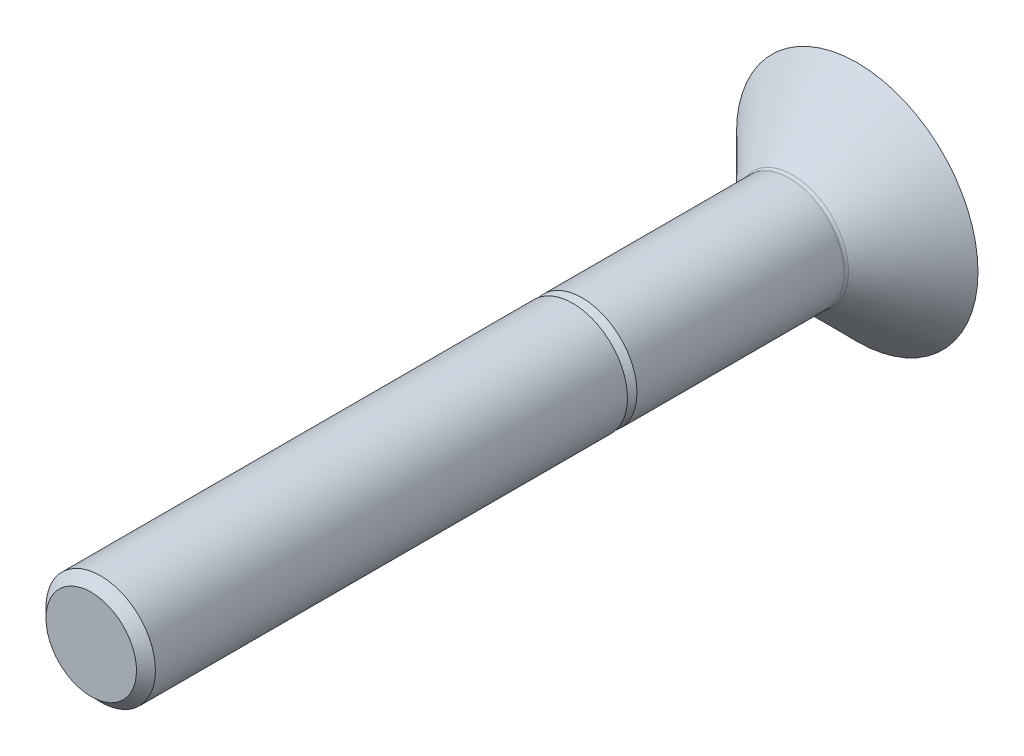
ISO-10303-21;
HEADER;
FILE_DESCRIPTION(('STEP AP214'),'2;1');
FILE_NAME('part.step','',(''),(''),'','','');
FILE_SCHEMA(('AUTOMOTIVE_DESIGN { 1 0 10303 214 1 1 1 1 }'));
ENDSEC;
DATA;
#1=APPLICATION_CONTEXT('core data for automotive mechanical design processes');
#2=APPLICATION_PROTOCOL_DEFINITION('international standard','automotive_design',2000,#1);
#3=PRODUCT_CONTEXT('',#1,'mechanical');
#4=PRODUCT('Part','Part','',(#3));
#5=PRODUCT_RELATED_PRODUCT_CATEGORY('part','',(#4));
#6=PRODUCT_DEFINITION_FORMATION('','',#4);
#7=PRODUCT_DEFINITION_CONTEXT('part definition',#1,'design');
#8=PRODUCT_DEFINITION('design','',#6,#7);
#9=PRODUCT_DEFINITION_SHAPE('','',#8);
#10=(LENGTH_UNIT() NAMED_UNIT(*) SI_UNIT(.MILLI.,.METRE.));
#11=(NAMED_UNIT(*) PLANE_ANGLE_UNIT() SI_UNIT($,.RADIAN.));
#12=(NAMED_UNIT(*) SI_UNIT($,.STERADIAN.) SOLID_ANGLE_UNIT());
#13=UNCERTAINTY_MEASURE_WITH_UNIT(LENGTH_MEASURE(1.E-05),#10,'distance_accuracy_value','');
#14=(GEOMETRIC_REPRESENTATION_CONTEXT(3) GLOBAL_UNCERTAINTY_ASSIGNED_CONTEXT((#13)) GLOBAL_UNIT_ASSIGNED_CONTEXT((#10,
#11,#12)) REPRESENTATION_CONTEXT('',''));
#15=CARTESIAN_POINT('',(0.,0.,0.));
#16=DIRECTION('',(0.,0.,1.));
#17=DIRECTION('',(1.,0.,0.));
#18=AXIS2_PLACEMENT_3D('',#15,#16,#17);
#19=CARTESIAN_POINT('',(0.,1.0335,35.));
#20=DIRECTION('',(0.,0.,1.));
#21=DIRECTION('',(0.,1.,0.));
#22=AXIS2_PLACEMENT_3D('',#19,#20,#21);
#23=PLANE('',#22);
#24=CARTESIAN_POINT('',(0.,0.,35.));
#25=DIRECTION('',(0.,0.,1.));
#26=DIRECTION('',(0.,1.,0.));
#27=AXIS2_PLACEMENT_3D('',#24,#25,#26);
#28=CIRCLE('',#27,2.067);
#29=CARTESIAN_POINT('',(0.,2.067,35.));
#30=VERTEX_POINT('',#29);
#31=EDGE_CURVE('E12',#30,#30,#28,.T.);
#32=ORIENTED_EDGE('',*,*,#31,.T.);
#33=EDGE_LOOP('',(#32));
#34=FACE_BOUND('',#33,.T.);
#35=ADVANCED_FACE('F19',(#34),#23,.T.);
#36=CARTESIAN_POINT('',(0.,0.,34.7835));
#37=DIRECTION('',(0.,0.,-1.));
#38=DIRECTION('',(0.,1.,0.));
#39=AXIS2_PLACEMENT_3D('',#36,#37,#38);
#40=CONICAL_SURFACE('',#39,2.2835,0.785398163397448);
#41=CARTESIAN_POINT('',(0.,0.,34.567));
#42=DIRECTION('',(0.,0.,1.));
#43=DIRECTION('',(0.,1.,0.));
#44=AXIS2_PLACEMENT_3D('',#41,#42,#43);
#45=CIRCLE('',#44,2.5);
#46=CARTESIAN_POINT('',(0.,2.5,34.567));
#47=VERTEX_POINT('',#46);
#48=EDGE_CURVE('E29',#47,#47,#45,.T.);
#49=ORIENTED_EDGE('',*,*,#48,.T.);
#50=EDGE_LOOP('',(#49));
#51=FACE_BOUND('',#50,.T.);
#52=ORIENTED_EDGE('',*,*,#31,.F.);
#53=EDGE_LOOP('',(#52));
#54=FACE_BOUND('',#53,.T.);
#55=ADVANCED_FACE('F288',(#51,#54),#40,.T.);
#56=CARTESIAN_POINT('',(0.,0.,23.7835));
#57=DIRECTION('',(0.,0.,-1.));
#58=DIRECTION('',(0.,1.,0.));
#59=AXIS2_PLACEMENT_3D('',#56,#57,#58);
#60=CYLINDRICAL_SURFACE('',#59,2.5);
#61=CARTESIAN_POINT('',(0.,0.,13.));
#62=DIRECTION('',(0.,0.,1.));
#63=DIRECTION('',(0.,1.,0.));
#64=AXIS2_PLACEMENT_3D('',#61,#62,#63);
#65=CIRCLE('',#64,2.5);
#66=CARTESIAN_POINT('',(0.,2.5,13.));
#67=VERTEX_POINT('',#66);
#68=EDGE_CURVE('E162',#67,#67,#65,.T.);
#69=ORIENTED_EDGE('',*,*,#68,.T.);
#70=EDGE_LOOP('',(#69));
#71=FACE_BOUND('',#70,.T.);
#72=ORIENTED_EDGE('',*,*,#48,.F.);
#73=EDGE_LOOP('',(#72));
#74=FACE_BOUND('',#73,.T.);
#75=ADVANCED_FACE('F292',(#71,#74),#60,.T.);
#76=CARTESIAN_POINT('',(0.,2.2835,13.));
#77=DIRECTION('',(0.,0.,-1.));
#78=DIRECTION('',(0.,-1.,0.));
#79=AXIS2_PLACEMENT_3D('',#76,#77,#78);
#80=PLANE('',#79);
#81=CARTESIAN_POINT('',(0.,0.,13.));
#82=DIRECTION('',(0.,0.,1.));
#83=DIRECTION('',(0.,1.,0.));
#84=AXIS2_PLACEMENT_3D('',#81,#82,#83);
#85=CIRCLE('',#84,2.067);
#86=CARTESIAN_POINT('',(0.,2.067,13.));
#87=VERTEX_POINT('',#86);
#88=EDGE_CURVE('E166',#87,#87,#85,.T.);
#89=ORIENTED_EDGE('',*,*,#88,.T.);
#90=EDGE_LOOP('',(#89));
#91=FACE_BOUND('',#90,.T.);
#92=ORIENTED_EDGE('',*,*,#68,.F.);
#93=EDGE_LOOP('',(#92));
#94=FACE_BOUND('',#93,.T.);
#95=ADVANCED_FACE('F299',(#91,#94),#80,.T.);
#96=CARTESIAN_POINT('',(0.,0.,12.7835));
#97=DIRECTION('',(0.,0.,-1.));
#98=DIRECTION('',(0.,1.,0.));
#99=AXIS2_PLACEMENT_3D('',#96,#97,#98);
#100=CONICAL_SURFACE('',#99,2.2835,0.785398163397448);
#101=CARTESIAN_POINT('',(0.,0.,12.567));
#102=DIRECTION('',(0.,0.,1.));
#103=DIRECTION('',(0.,1.,0.));
#104=AXIS2_PLACEMENT_3D('',#101,#102,#103);
#105=CIRCLE('',#104,2.5);
#106=CARTESIAN_POINT('',(0.,2.5,12.567));
#107=VERTEX_POINT('',#106);
#108=EDGE_CURVE('E206',#107,#107,#105,.T.);
#109=ORIENTED_EDGE('',*,*,#108,.T.);
#110=EDGE_LOOP('',(#109));
#111=FACE_BOUND('',#110,.T.);
#112=ORIENTED_EDGE('',*,*,#88,.F.);
#113=EDGE_LOOP('',(#112));
#114=FACE_BOUND('',#113,.T.);
#115=ADVANCED_FACE('F296',(#111,#114),#100,.T.);
#116=CARTESIAN_POINT('',(0.,0.,7.8335));
#117=DIRECTION('',(0.,0.,-1.));
#118=DIRECTION('',(0.,1.,0.));
#119=AXIS2_PLACEMENT_3D('',#116,#117,#118);
#120=CYLINDRICAL_SURFACE('',#119,2.5);
#121=CARTESIAN_POINT('',(0.,0.,3.1));
#122=DIRECTION('',(0.,0.,1.));
#123=DIRECTION('',(0.,1.,0.));
#124=AXIS2_PLACEMENT_3D('',#121,#122,#123);
#125=CIRCLE('',#124,2.5);
#126=CARTESIAN_POINT('',(0.,2.5,3.1));
#127=VERTEX_POINT('',#126);
#128=EDGE_CURVE('E209',#127,#127,#125,.T.);
#129=ORIENTED_EDGE('',*,*,#128,.T.);
#130=EDGE_LOOP('',(#129));
#131=FACE_BOUND('',#130,.T.);
#132=ORIENTED_EDGE('',*,*,#108,.F.);
#133=EDGE_LOOP('',(#132));
#134=FACE_BOUND('',#133,.T.);
#135=ADVANCED_FACE('F298',(#131,#134),#120,.T.);
#136=CARTESIAN_POINT('',(0.,0.,3.1));
#137=DIRECTION('',(0.,0.,1.));
#138=DIRECTION('',(1.,0.,0.));
#139=AXIS2_PLACEMENT_3D('',#136,#137,#138);
#140=TOROIDAL_SURFACE('',#139,2.7,0.2);
#141=CARTESIAN_POINT('',(0.,0.,2.95857864376269));
#142=DIRECTION('',(0.,0.,1.));
#143=DIRECTION('',(0.,1.,0.));
#144=AXIS2_PLACEMENT_3D('',#141,#142,#143);
#145=CIRCLE('',#144,2.55857864376269);
#146=CARTESIAN_POINT('',(0.,2.55857864376269,2.95857864376269));
#147=VERTEX_POINT('',#146);
#148=EDGE_CURVE('E181',#147,#147,#145,.T.);
#149=ORIENTED_EDGE('',*,*,#148,.T.);
#150=EDGE_LOOP('',(#149));
#151=FACE_BOUND('',#150,.T.);
#152=ORIENTED_EDGE('',*,*,#128,.F.);
#153=EDGE_LOOP('',(#152));
#154=FACE_BOUND('',#153,.T.);
#155=ADVANCED_FACE('F318',(#151,#154),#140,.F.);
#156=CARTESIAN_POINT('',(0.,0.,1.47928932188135));
#157=DIRECTION('',(0.,0.,-1.));
#158=DIRECTION('',(0.,1.,0.));
#159=AXIS2_PLACEMENT_3D('',#156,#157,#158);
#160=CONICAL_SURFACE('',#159,4.03786796564404,0.785398163397448);
#161=CARTESIAN_POINT('',(0.,0.,0.));
#162=DIRECTION('',(0.,0.,1.));
#163=DIRECTION('',(0.,1.,0.));
#164=AXIS2_PLACEMENT_3D('',#161,#162,#163);
#165=CIRCLE('',#164,5.51715728752538);
#166=CARTESIAN_POINT('',(0.,5.51715728752538,0.));
#167=VERTEX_POINT('',#166);
#168=EDGE_CURVE('E178',#167,#167,#165,.T.);
#169=ORIENTED_EDGE('',*,*,#168,.T.);
#170=EDGE_LOOP('',(#169));
#171=FACE_BOUND('',#170,.T.);
#172=ORIENTED_EDGE('',*,*,#148,.F.);
#173=EDGE_LOOP('',(#172));
#174=FACE_BOUND('',#173,.T.);
#175=ADVANCED_FACE('F308',(#171,#174),#160,.T.);
#176=CARTESIAN_POINT('',(0.,2.75857864376269,0.));
#177=DIRECTION('',(0.,0.,-1.));
#178=DIRECTION('',(0.,-1.,0.));
#179=AXIS2_PLACEMENT_3D('',#176,#177,#178);
#180=PLANE('',#179);
#181=ORIENTED_EDGE('',*,*,#168,.F.);
#182=EDGE_LOOP('',(#181));
#183=FACE_BOUND('',#182,.T.);
#184=DIRECTION('',(0.866025403784439,-0.5,0.));
#185=VECTOR('',#184,1.);
#186=CARTESIAN_POINT('',(-1.34724979595893,-0.954215775206322,0.));
#187=LINE('',#186,#185);
#188=CARTESIAN_POINT('',(-1.5,-0.866025403784439,0.));
#189=VERTEX_POINT('',#188);
#190=CARTESIAN_POINT('',(0.,-1.73205080756887,0.));
#191=VERTEX_POINT('',#190);
#192=EDGE_CURVE('E228',#189,#191,#187,.T.);
#193=ORIENTED_EDGE('',*,*,#192,.T.);
#194=DIRECTION('',(0.866025403784439,0.5,0.));
#195=VECTOR('',#194,1.);
#196=CARTESIAN_POINT('',(1.34724979595893,-0.954215775206322,0.));
#197=LINE('',#196,#195);
#198=CARTESIAN_POINT('',(1.5,-0.866025403784439,0.));
#199=VERTEX_POINT('',#198);
#200=EDGE_CURVE('E134',#191,#199,#197,.T.);
#201=ORIENTED_EDGE('',*,*,#200,.T.);
#202=DIRECTION('',(0.,1.,0.));
#203=VECTOR('',#202,1.);
#204=CARTESIAN_POINT('',(1.5,1.37928932188134,0.));
#205=LINE('',#204,#203);
#206=CARTESIAN_POINT('',(1.5,0.866025403784438,0.));
#207=VERTEX_POINT('',#206);
#208=EDGE_CURVE('E190',#199,#207,#205,.T.);
#209=ORIENTED_EDGE('',*,*,#208,.T.);
#210=DIRECTION('',(-0.866025403784439,0.5,0.));
#211=VECTOR('',#210,1.);
#212=CARTESIAN_POINT('',(0.152750204041072,1.643860436147,0.));
#213=LINE('',#212,#211);
#214=CARTESIAN_POINT('',(0.,1.73205080756887,0.));
#215=VERTEX_POINT('',#214);
#216=EDGE_CURVE('E129',#207,#215,#213,.T.);
#217=ORIENTED_EDGE('',*,*,#216,.T.);
#218=DIRECTION('',(-0.866025403784439,-0.5,0.));
#219=VECTOR('',#218,1.);
#220=CARTESIAN_POINT('',(-0.152750204041072,1.643860436147,0.));
#221=LINE('',#220,#219);
#222=CARTESIAN_POINT('',(-1.5,0.86602540378444,0.));
#223=VERTEX_POINT('',#222);
#224=EDGE_CURVE('E159',#215,#223,#221,.T.);
#225=ORIENTED_EDGE('',*,*,#224,.T.);
#226=DIRECTION('',(0.,-1.,0.));
#227=VECTOR('',#226,1.);
#228=CARTESIAN_POINT('',(-1.5,1.37928932188135,0.));
#229=LINE('',#228,#227);
#230=EDGE_CURVE('E205',#223,#189,#229,.T.);
#231=ORIENTED_EDGE('',*,*,#230,.T.);
#232=EDGE_LOOP('',(#193,#201,#209,#217,#225,#231));
#233=FACE_BOUND('',#232,.T.);
#234=ADVANCED_FACE('F304',(#183,#233),#180,.T.);
#235=CARTESIAN_POINT('',(0.75,-1.29903810567666,-1.));
#236=DIRECTION('',(0.5,-0.866025403784439,0.));
#237=DIRECTION('',(0.866025403784439,0.5,0.));
#238=AXIS2_PLACEMENT_3D('',#235,#236,#237);
#239=PLANE('',#238);
#240=ORIENTED_EDGE('',*,*,#200,.F.);
#241=DIRECTION('',(0.,0.,1.));
#242=VECTOR('',#241,1.);
#243=CARTESIAN_POINT('',(0.,-1.73205080756887,-1.));
#244=LINE('',#243,#242);
#245=CARTESIAN_POINT('',(0.,-1.73205080756887,1.9));
#246=VERTEX_POINT('',#245);
#247=EDGE_CURVE('E192',#191,#246,#244,.T.);
#248=ORIENTED_EDGE('',*,*,#247,.T.);
#249=DIRECTION('',(-0.866025403784439,-0.5,0.));
#250=VECTOR('',#249,1.);
#251=CARTESIAN_POINT('',(0.,-1.73205080756887,1.9));
#252=LINE('',#251,#250);
#253=CARTESIAN_POINT('',(0.75,-1.29903810567666,1.9));
#254=VERTEX_POINT('',#253);
#255=EDGE_CURVE('E60',#254,#246,#252,.T.);
#256=ORIENTED_EDGE('',*,*,#255,.F.);
#257=DIRECTION('',(-0.866025403784439,-0.5,0.));
#258=VECTOR('',#257,1.);
#259=CARTESIAN_POINT('',(0.,-1.73205080756887,1.9));
#260=LINE('',#259,#258);
#261=CARTESIAN_POINT('',(1.5,-0.866025403784439,1.9));
#262=VERTEX_POINT('',#261);
#263=EDGE_CURVE('E184',#262,#254,#260,.T.);
#264=ORIENTED_EDGE('',*,*,#263,.F.);
#265=DIRECTION('',(0.,0.,1.));
#266=VECTOR('',#265,1.);
#267=CARTESIAN_POINT('',(1.5,-0.866025403784439,-1.));
#268=LINE('',#267,#266);
#269=EDGE_CURVE('E23',#199,#262,#268,.T.);
#270=ORIENTED_EDGE('',*,*,#269,.F.);
#271=EDGE_LOOP('',(#240,#248,#256,#264,#270));
#272=FACE_BOUND('',#271,.T.);
#273=ADVANCED_FACE('F307',(#272),#239,.F.);
#274=CARTESIAN_POINT('',(1.5,0.,-1.));
#275=DIRECTION('',(1.,0.,0.));
#276=DIRECTION('',(0.,1.,0.));
#277=AXIS2_PLACEMENT_3D('',#274,#275,#276);
#278=PLANE('',#277);
#279=ORIENTED_EDGE('',*,*,#208,.F.);
#280=ORIENTED_EDGE('',*,*,#269,.T.);
#281=DIRECTION('',(0.,-1.,0.));
#282=VECTOR('',#281,1.);
#283=CARTESIAN_POINT('',(1.5,-0.866025403784439,1.9));
#284=LINE('',#283,#282);
#285=CARTESIAN_POINT('',(1.5,0.,1.9));
#286=VERTEX_POINT('',#285);
#287=EDGE_CURVE('E111',#286,#262,#284,.T.);
#288=ORIENTED_EDGE('',*,*,#287,.F.);
#289=DIRECTION('',(0.,-1.,0.));
#290=VECTOR('',#289,1.);
#291=CARTESIAN_POINT('',(1.5,-0.866025403784439,1.9));
#292=LINE('',#291,#290);
#293=CARTESIAN_POINT('',(1.5,0.866025403784438,1.9));
#294=VERTEX_POINT('',#293);
#295=EDGE_CURVE('E103',#294,#286,#292,.T.);
#296=ORIENTED_EDGE('',*,*,#295,.F.);
#297=DIRECTION('',(0.,0.,1.));
#298=VECTOR('',#297,1.);
#299=CARTESIAN_POINT('',(1.5,0.866025403784438,-1.));
#300=LINE('',#299,#298);
#301=EDGE_CURVE('E108',#207,#294,#300,.T.);
#302=ORIENTED_EDGE('',*,*,#301,.F.);
#303=EDGE_LOOP('',(#279,#280,#288,#296,#302));
#304=FACE_BOUND('',#303,.T.);
#305=ADVANCED_FACE('F106',(#304),#278,.F.);
#306=CARTESIAN_POINT('',(-0.75,-1.29903810567666,-1.));
#307=DIRECTION('',(-0.5,-0.866025403784439,0.));
#308=DIRECTION('',(0.866025403784439,-0.5,0.));
#309=AXIS2_PLACEMENT_3D('',#306,#307,#308);
#310=PLANE('',#309);
#311=ORIENTED_EDGE('',*,*,#192,.F.);
#312=DIRECTION('',(0.,0.,1.));
#313=VECTOR('',#312,1.);
#314=CARTESIAN_POINT('',(-1.5,-0.866025403784439,-1.));
#315=LINE('',#314,#313);
#316=CARTESIAN_POINT('',(-1.5,-0.866025403784439,1.9));
#317=VERTEX_POINT('',#316);
#318=EDGE_CURVE('E158',#189,#317,#315,.T.);
#319=ORIENTED_EDGE('',*,*,#318,.T.);
#320=DIRECTION('',(-0.866025403784439,0.5,0.));
#321=VECTOR('',#320,1.);
#322=CARTESIAN_POINT('',(-1.5,-0.866025403784439,1.9));
#323=LINE('',#322,#321);
#324=CARTESIAN_POINT('',(-0.75,-1.29903810567666,1.9));
#325=VERTEX_POINT('',#324);
#326=EDGE_CURVE('E114',#325,#317,#323,.T.);
#327=ORIENTED_EDGE('',*,*,#326,.F.);
#328=DIRECTION('',(-0.866025403784439,0.5,0.));
#329=VECTOR('',#328,1.);
#330=CARTESIAN_POINT('',(-1.5,-0.866025403784439,1.9));
#331=LINE('',#330,#329);
#332=EDGE_CURVE('E49',#246,#325,#331,.T.);
#333=ORIENTED_EDGE('',*,*,#332,.F.);
#334=ORIENTED_EDGE('',*,*,#247,.F.);
#335=EDGE_LOOP('',(#311,#319,#327,#333,#334));
#336=FACE_BOUND('',#335,.T.);
#337=ADVANCED_FACE('F251',(#336),#310,.F.);
#338=CARTESIAN_POINT('',(0.,0.,1.9));
#339=DIRECTION('',(0.,0.,1.));
#340=DIRECTION('',(1.,0.,0.));
#341=AXIS2_PLACEMENT_3D('',#338,#339,#340);
#342=PLANE('',#341);
#343=CARTESIAN_POINT('',(0.,0.,1.9));
#344=DIRECTION('',(0.,0.,-1.));
#345=DIRECTION('',(0.,1.,0.));
#346=AXIS2_PLACEMENT_3D('',#343,#344,#345);
#347=CIRCLE('',#346,1.5);
#348=EDGE_CURVE('E141',#254,#325,#347,.T.);
#349=ORIENTED_EDGE('',*,*,#348,.F.);
#350=ORIENTED_EDGE('',*,*,#255,.T.);
#351=ORIENTED_EDGE('',*,*,#332,.T.);
#352=EDGE_LOOP('',(#349,#350,#351));
#353=FACE_BOUND('',#352,.T.);
#354=ADVANCED_FACE('F324',(#353),#342,.F.);
#355=CARTESIAN_POINT('',(0.,0.,1.9));
#356=DIRECTION('',(0.,0.,1.));
#357=DIRECTION('',(1.,0.,0.));
#358=AXIS2_PLACEMENT_3D('',#355,#356,#357);
#359=PLANE('',#358);
#360=CARTESIAN_POINT('',(0.,0.,1.9));
#361=DIRECTION('',(0.,0.,-1.));
#362=DIRECTION('',(0.,1.,0.));
#363=AXIS2_PLACEMENT_3D('',#360,#361,#362);
#364=CIRCLE('',#363,1.5);
#365=EDGE_CURVE('E137',#286,#254,#364,.T.);
#366=ORIENTED_EDGE('',*,*,#365,.F.);
#367=ORIENTED_EDGE('',*,*,#287,.T.);
#368=ORIENTED_EDGE('',*,*,#263,.T.);
#369=EDGE_LOOP('',(#366,#367,#368));
#370=FACE_BOUND('',#369,.T.);
#371=ADVANCED_FACE('F21',(#370),#359,.F.);
#372=CARTESIAN_POINT('',(0.,0.,1.9));
#373=DIRECTION('',(0.,0.,1.));
#374=DIRECTION('',(1.,0.,0.));
#375=AXIS2_PLACEMENT_3D('',#372,#373,#374);
#376=PLANE('',#375);
#377=CARTESIAN_POINT('',(0.,0.,1.9));
#378=DIRECTION('',(0.,0.,-1.));
#379=DIRECTION('',(0.,1.,0.));
#380=AXIS2_PLACEMENT_3D('',#377,#378,#379);
#381=CIRCLE('',#380,1.5);
#382=CARTESIAN_POINT('',(0.75,1.29903810567666,1.9));
#383=VERTEX_POINT('',#382);
#384=EDGE_CURVE('E120',#383,#286,#381,.T.);
#385=ORIENTED_EDGE('',*,*,#384,.F.);
#386=DIRECTION('',(0.866025403784439,-0.5,0.));
#387=VECTOR('',#386,1.);
#388=CARTESIAN_POINT('',(1.5,0.866025403784438,1.9));
#389=LINE('',#388,#387);
#390=EDGE_CURVE('E117',#383,#294,#389,.T.);
#391=ORIENTED_EDGE('',*,*,#390,.T.);
#392=ORIENTED_EDGE('',*,*,#295,.T.);
#393=EDGE_LOOP('',(#385,#391,#392));
#394=FACE_BOUND('',#393,.T.);
#395=ADVANCED_FACE('F118',(#394),#376,.F.);
#396=CARTESIAN_POINT('',(0.,0.,1.9));
#397=DIRECTION('',(0.,0.,1.));
#398=DIRECTION('',(1.,0.,0.));
#399=AXIS2_PLACEMENT_3D('',#396,#397,#398);
#400=PLANE('',#399);
#401=CARTESIAN_POINT('',(0.,0.,1.9));
#402=DIRECTION('',(0.,0.,-1.));
#403=DIRECTION('',(0.,1.,0.));
#404=AXIS2_PLACEMENT_3D('',#401,#402,#403);
#405=CIRCLE('',#404,1.5);
#406=CARTESIAN_POINT('',(-0.75,1.29903810567666,1.9));
#407=VERTEX_POINT('',#406);
#408=EDGE_CURVE('E154',#407,#383,#405,.T.);
#409=ORIENTED_EDGE('',*,*,#408,.F.);
#410=DIRECTION('',(0.866025403784439,0.5,0.));
#411=VECTOR('',#410,1.);
#412=CARTESIAN_POINT('',(0.,1.73205080756887,1.9));
#413=LINE('',#412,#411);
#414=CARTESIAN_POINT('',(0.,1.73205080756887,1.9));
#415=VERTEX_POINT('',#414);
#416=EDGE_CURVE('E236',#407,#415,#413,.T.);
#417=ORIENTED_EDGE('',*,*,#416,.T.);
#418=DIRECTION('',(0.866025403784439,-0.5,0.));
#419=VECTOR('',#418,1.);
#420=CARTESIAN_POINT('',(1.5,0.866025403784438,1.9));
#421=LINE('',#420,#419);
#422=EDGE_CURVE('E124',#415,#383,#421,.T.);
#423=ORIENTED_EDGE('',*,*,#422,.T.);
#424=EDGE_LOOP('',(#409,#417,#423));
#425=FACE_BOUND('',#424,.T.);
#426=ADVANCED_FACE('F312',(#425),#400,.F.);
#427=CARTESIAN_POINT('',(0.,0.,1.9));
#428=DIRECTION('',(0.,0.,1.));
#429=DIRECTION('',(1.,0.,0.));
#430=AXIS2_PLACEMENT_3D('',#427,#428,#429);
#431=PLANE('',#430);
#432=CARTESIAN_POINT('',(0.,0.,1.9));
#433=DIRECTION('',(0.,0.,-1.));
#434=DIRECTION('',(0.,1.,0.));
#435=AXIS2_PLACEMENT_3D('',#432,#433,#434);
#436=CIRCLE('',#435,1.5);
#437=CARTESIAN_POINT('',(-1.5,0.,1.9));
#438=VERTEX_POINT('',#437);
#439=EDGE_CURVE('E185',#438,#407,#436,.T.);
#440=ORIENTED_EDGE('',*,*,#439,.F.);
#441=DIRECTION('',(0.,1.,0.));
#442=VECTOR('',#441,1.);
#443=CARTESIAN_POINT('',(-1.5,0.86602540378444,1.9));
#444=LINE('',#443,#442);
#445=CARTESIAN_POINT('',(-1.5,0.86602540378444,1.9));
#446=VERTEX_POINT('',#445);
#447=EDGE_CURVE('E202',#438,#446,#444,.T.);
#448=ORIENTED_EDGE('',*,*,#447,.T.);
#449=DIRECTION('',(0.866025403784439,0.5,0.));
#450=VECTOR('',#449,1.);
#451=CARTESIAN_POINT('',(0.,1.73205080756887,1.9));
#452=LINE('',#451,#450);
#453=EDGE_CURVE('E234',#446,#407,#452,.T.);
#454=ORIENTED_EDGE('',*,*,#453,.T.);
#455=EDGE_LOOP('',(#440,#448,#454));
#456=FACE_BOUND('',#455,.T.);
#457=ADVANCED_FACE('F284',(#456),#431,.F.);
#458=CARTESIAN_POINT('',(0.,0.,1.9));
#459=DIRECTION('',(0.,0.,1.));
#460=DIRECTION('',(1.,0.,0.));
#461=AXIS2_PLACEMENT_3D('',#458,#459,#460);
#462=PLANE('',#461);
#463=CARTESIAN_POINT('',(0.,0.,1.9));
#464=DIRECTION('',(0.,0.,-1.));
#465=DIRECTION('',(0.,1.,0.));
#466=AXIS2_PLACEMENT_3D('',#463,#464,#465);
#467=CIRCLE('',#466,1.5);
#468=EDGE_CURVE('E189',#325,#438,#467,.T.);
#469=ORIENTED_EDGE('',*,*,#468,.F.);
#470=ORIENTED_EDGE('',*,*,#326,.T.);
#471=DIRECTION('',(0.,1.,0.));
#472=VECTOR('',#471,1.);
#473=CARTESIAN_POINT('',(-1.5,0.86602540378444,1.9));
#474=LINE('',#473,#472);
#475=EDGE_CURVE('E204',#317,#438,#474,.T.);
#476=ORIENTED_EDGE('',*,*,#475,.T.);
#477=EDGE_LOOP('',(#469,#470,#476));
#478=FACE_BOUND('',#477,.T.);
#479=ADVANCED_FACE('F259',(#478),#462,.F.);
#480=CARTESIAN_POINT('',(0.,0.,2.33301270189222));
#481=DIRECTION('',(0.,0.,-1.));
#482=DIRECTION('',(0.,1.,0.));
#483=AXIS2_PLACEMENT_3D('',#480,#481,#482);
#484=CONICAL_SURFACE('',#483,0.75,1.0471975511966);
#485=ORIENTED_EDGE('',*,*,#408,.T.);
#486=ORIENTED_EDGE('',*,*,#384,.T.);
#487=ORIENTED_EDGE('',*,*,#365,.T.);
#488=ORIENTED_EDGE('',*,*,#348,.T.);
#489=ORIENTED_EDGE('',*,*,#468,.T.);
#490=ORIENTED_EDGE('',*,*,#439,.T.);
#491=EDGE_LOOP('',(#485,#486,#487,#488,#489,#490));
#492=FACE_BOUND('',#491,.T.);
#493=CARTESIAN_POINT('',(0.,0.,2.76602540378444));
#494=VERTEX_POINT('',#493);
#495=VERTEX_LOOP('',#494);
#496=FACE_BOUND('',#495,.T.);
#497=ADVANCED_FACE('F273',(#492,#496),#484,.F.);
#498=CARTESIAN_POINT('',(-1.5,0.,-1.));
#499=DIRECTION('',(-1.,0.,0.));
#500=DIRECTION('',(0.,-1.,0.));
#501=AXIS2_PLACEMENT_3D('',#498,#499,#500);
#502=PLANE('',#501);
#503=ORIENTED_EDGE('',*,*,#230,.F.);
#504=DIRECTION('',(0.,0.,1.));
#505=VECTOR('',#504,1.);
#506=CARTESIAN_POINT('',(-1.5,0.86602540378444,-1.));
#507=LINE('',#506,#505);
#508=EDGE_CURVE('E167',#223,#446,#507,.T.);
#509=ORIENTED_EDGE('',*,*,#508,.T.);
#510=ORIENTED_EDGE('',*,*,#447,.F.);
#511=ORIENTED_EDGE('',*,*,#475,.F.);
#512=ORIENTED_EDGE('',*,*,#318,.F.);
#513=EDGE_LOOP('',(#503,#509,#510,#511,#512));
#514=FACE_BOUND('',#513,.T.);
#515=ADVANCED_FACE('F257',(#514),#502,.F.);
#516=CARTESIAN_POINT('',(-0.75,1.29903810567666,-1.));
#517=DIRECTION('',(-0.5,0.866025403784439,0.));
#518=DIRECTION('',(-0.866025403784439,-0.5,0.));
#519=AXIS2_PLACEMENT_3D('',#516,#517,#518);
#520=PLANE('',#519);
#521=ORIENTED_EDGE('',*,*,#224,.F.);
#522=DIRECTION('',(0.,0.,1.));
#523=VECTOR('',#522,1.);
#524=CARTESIAN_POINT('',(0.,1.73205080756887,-1.));
#525=LINE('',#524,#523);
#526=EDGE_CURVE('E214',#215,#415,#525,.T.);
#527=ORIENTED_EDGE('',*,*,#526,.T.);
#528=ORIENTED_EDGE('',*,*,#416,.F.);
#529=ORIENTED_EDGE('',*,*,#453,.F.);
#530=ORIENTED_EDGE('',*,*,#508,.F.);
#531=EDGE_LOOP('',(#521,#527,#528,#529,#530));
#532=FACE_BOUND('',#531,.T.);
#533=ADVANCED_FACE('F282',(#532),#520,.F.);
#534=CARTESIAN_POINT('',(0.75,1.29903810567666,-1.));
#535=DIRECTION('',(0.5,0.866025403784439,0.));
#536=DIRECTION('',(-0.866025403784439,0.5,0.));
#537=AXIS2_PLACEMENT_3D('',#534,#535,#536);
#538=PLANE('',#537);
#539=ORIENTED_EDGE('',*,*,#216,.F.);
#540=ORIENTED_EDGE('',*,*,#301,.T.);
#541=ORIENTED_EDGE('',*,*,#390,.F.);
#542=ORIENTED_EDGE('',*,*,#422,.F.);
#543=ORIENTED_EDGE('',*,*,#526,.F.);
#544=EDGE_LOOP('',(#539,#540,#541,#542,#543));
#545=FACE_BOUND('',#544,.T.);
#546=ADVANCED_FACE('F126',(#545),#538,.F.);
#547=CLOSED_SHELL('',(#35,#55,#75,#95,#115,#135,#155,#175,#234,#273,#305,#337,#354,#371,#395,
#426,#457,#479,#497,#515,#533,#546));
#548=MANIFOLD_SOLID_BREP('B1',#547);
#549=ADVANCED_BREP_SHAPE_REPRESENTATION('',(#18,#548),#14);
#550=SHAPE_DEFINITION_REPRESENTATION(#9,#549);
ENDSEC;
END-ISO-10303-21;
